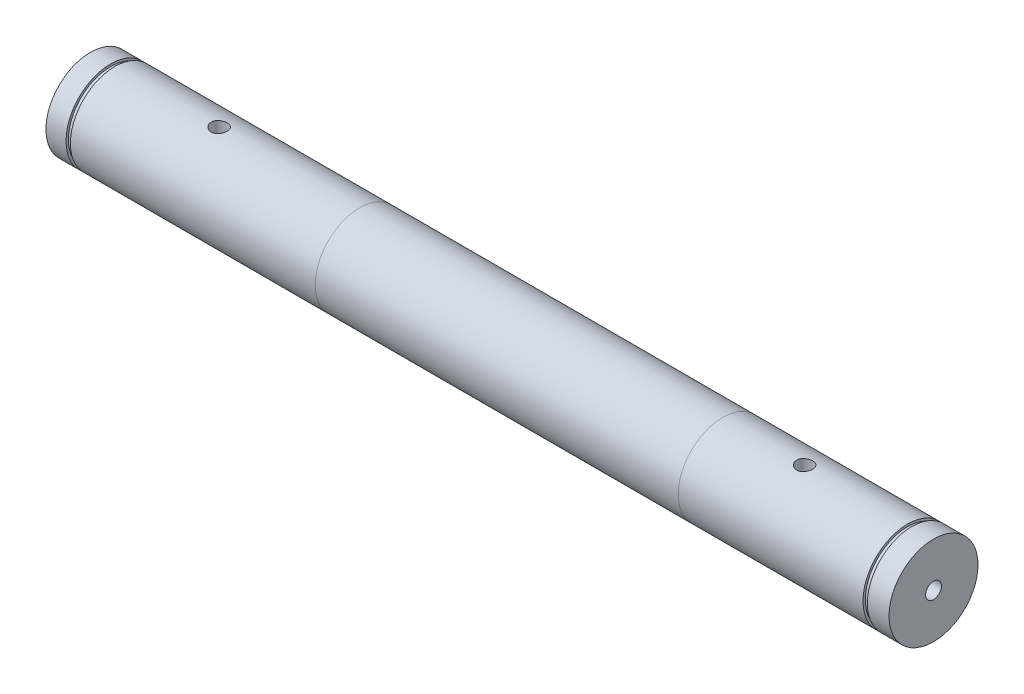
ISO-10303-21;
HEADER;
FILE_DESCRIPTION(('STEP AP214'),'2;1');
FILE_NAME('part.step','',(''),(''),'','','');
FILE_SCHEMA(('AUTOMOTIVE_DESIGN { 1 0 10303 214 1 1 1 1 }'));
ENDSEC;
DATA;
#1=APPLICATION_CONTEXT('core data for automotive mechanical design processes');
#2=APPLICATION_PROTOCOL_DEFINITION('international standard','automotive_design',2000,#1);
#3=PRODUCT_CONTEXT('',#1,'mechanical');
#4=PRODUCT('Part','Part','',(#3));
#5=PRODUCT_RELATED_PRODUCT_CATEGORY('part','',(#4));
#6=PRODUCT_DEFINITION_FORMATION('','',#4);
#7=PRODUCT_DEFINITION_CONTEXT('part definition',#1,'design');
#8=PRODUCT_DEFINITION('design','',#6,#7);
#9=PRODUCT_DEFINITION_SHAPE('','',#8);
#10=(LENGTH_UNIT() NAMED_UNIT(*) SI_UNIT(.MILLI.,.METRE.));
#11=(NAMED_UNIT(*) PLANE_ANGLE_UNIT() SI_UNIT($,.RADIAN.));
#12=(NAMED_UNIT(*) SI_UNIT($,.STERADIAN.) SOLID_ANGLE_UNIT());
#13=UNCERTAINTY_MEASURE_WITH_UNIT(LENGTH_MEASURE(1.E-05),#10,'distance_accuracy_value','');
#14=(GEOMETRIC_REPRESENTATION_CONTEXT(3) GLOBAL_UNCERTAINTY_ASSIGNED_CONTEXT((#13)) GLOBAL_UNIT_ASSIGNED_CONTEXT((#10,
#11,#12)) REPRESENTATION_CONTEXT('',''));
#15=CARTESIAN_POINT('',(0.,0.,0.));
#16=DIRECTION('',(0.,0.,1.));
#17=DIRECTION('',(1.,0.,0.));
#18=AXIS2_PLACEMENT_3D('',#15,#16,#17);
#19=CARTESIAN_POINT('',(-65.,19.,0.));
#20=DIRECTION('',(-1.,0.,0.));
#21=DIRECTION('',(0.,0.,1.));
#22=AXIS2_PLACEMENT_3D('',#19,#20,#21);
#23=PLANE('',#22);
#24=CARTESIAN_POINT('',(-65.,0.,0.));
#25=DIRECTION('',(1.,0.,0.));
#26=DIRECTION('',(0.,0.,-1.));
#27=AXIS2_PLACEMENT_3D('',#24,#25,#26);
#28=CIRCLE('',#27,19.);
#29=CARTESIAN_POINT('',(-65.,0.,-19.));
#30=VERTEX_POINT('',#29);
#31=EDGE_CURVE('E143',#30,#30,#28,.T.);
#32=ORIENTED_EDGE('',*,*,#31,.T.);
#33=EDGE_LOOP('',(#32));
#34=FACE_BOUND('',#33,.T.);
#35=CARTESIAN_POINT('',(-65.,0.,0.));
#36=DIRECTION('',(-1.,0.,0.));
#37=DIRECTION('',(0.,0.,1.));
#38=AXIS2_PLACEMENT_3D('',#35,#36,#37);
#39=CIRCLE('',#38,19.0001);
#40=CARTESIAN_POINT('',(-65.,0.,19.0001));
#41=VERTEX_POINT('',#40);
#42=EDGE_CURVE('E60',#41,#41,#39,.T.);
#43=ORIENTED_EDGE('',*,*,#42,.T.);
#44=EDGE_LOOP('',(#43));
#45=FACE_BOUND('',#44,.T.);
#46=ADVANCED_FACE('F55',(#34,#45),#23,.T.);
#47=CARTESIAN_POINT('',(180.,0.,0.));
#48=DIRECTION('',(1.,0.,0.));
#49=DIRECTION('',(0.,0.,-1.));
#50=AXIS2_PLACEMENT_3D('',#47,#48,#49);
#51=CYLINDRICAL_SURFACE('',#50,19.);
#52=ORIENTED_EDGE('',*,*,#31,.F.);
#53=EDGE_LOOP('',(#52));
#54=FACE_BOUND('',#53,.T.);
#55=CARTESIAN_POINT('',(-125.,18.6933143128767,-3.39999999999999));
#56=CARTESIAN_POINT('',(-125.189331753353,18.6933178867436,-3.39999258265061));
#57=CARTESIAN_POINT('',(-125.378761631134,18.6962219395753,-3.38413174651706));
#58=CARTESIAN_POINT('',(-125.752291137871,18.7075115667315,-3.32114376759655));
#59=CARTESIAN_POINT('',(-125.936385929427,18.7159019626303,-3.27398912226165));
#60=CARTESIAN_POINT('',(-126.293786092897,18.737184255374,-3.14989854750344));
#61=CARTESIAN_POINT('',(-126.467100916784,18.7500721413048,-3.07298914710066));
#62=CARTESIAN_POINT('',(-126.798353030278,18.7788925325816,-2.89164080941314));
#63=CARTESIAN_POINT('',(-126.956291741895,18.7948247559776,-2.78720442118902));
#64=CARTESIAN_POINT('',(-127.254114979187,18.8281405946573,-2.55250332976381));
#65=CARTESIAN_POINT('',(-127.393799725705,18.845537313872,-2.4219869408782));
#66=CARTESIAN_POINT('',(-127.649411545907,18.8797059582988,-2.13937470562974));
#67=CARTESIAN_POINT('',(-127.765337125611,18.896477844167,-1.9872775032804));
#68=CARTESIAN_POINT('',(-127.97089893371,18.9276467742116,-1.66451623870905));
#69=CARTESIAN_POINT('',(-128.06034780756,18.9420265924623,-1.49373104745276));
#70=CARTESIAN_POINT('',(-128.209211220713,18.9666448485398,-1.13925767111149));
#71=CARTESIAN_POINT('',(-128.268628009267,18.9768835965002,-0.955570453496858));
#72=CARTESIAN_POINT('',(-128.355125652901,18.9919735457278,-0.58257505175427));
#73=CARTESIAN_POINT('',(-128.382542856144,18.9968807483784,-0.393347169611865));
#74=CARTESIAN_POINT('',(-128.405310171102,19.0009474622043,-0.0129178687317526));
#75=CARTESIAN_POINT('',(-128.400662779929,19.000107420961,0.178283395165884));
#76=CARTESIAN_POINT('',(-128.359692629151,18.9928183005088,0.554928265715592));
#77=CARTESIAN_POINT('',(-128.323731951324,18.9864333405515,0.740412677774006));
#78=CARTESIAN_POINT('',(-128.221727614246,18.9688435116848,1.10267144287136));
#79=CARTESIAN_POINT('',(-128.155682932631,18.9576384789723,1.27944549967414));
#80=CARTESIAN_POINT('',(-127.995034089232,18.9315594541004,1.6203270947338));
#81=CARTESIAN_POINT('',(-127.900283301535,18.9166666987673,1.78436403787881));
#82=CARTESIAN_POINT('',(-127.685019640589,18.8848624894979,2.09434593400835));
#83=CARTESIAN_POINT('',(-127.564504373202,18.8679508480233,2.2402892036639));
#84=CARTESIAN_POINT('',(-127.299131884899,18.8337063495992,2.51208380323722));
#85=CARTESIAN_POINT('',(-127.153958005001,18.8163709090591,2.63762582602129));
#86=CARTESIAN_POINT('',(-126.844449190012,18.7834596772822,2.86262325041768));
#87=CARTESIAN_POINT('',(-126.680114021704,18.7678839074673,2.9620783344717));
#88=CARTESIAN_POINT('',(-126.336559282488,18.7402527815937,3.13215518889858));
#89=CARTESIAN_POINT('',(-126.157318647899,18.7282025200313,3.20273529185498));
#90=CARTESIAN_POINT('',(-125.789260165896,18.7090672675827,3.31269492597933));
#91=CARTESIAN_POINT('',(-125.600443302082,18.7019817678564,3.35207765462952));
#92=CARTESIAN_POINT('',(-125.22137213968,18.6936780552635,3.39807984719533));
#93=CARTESIAN_POINT('',(-125.031173274732,18.6923805318584,3.40514222028133));
#94=CARTESIAN_POINT('',(-124.65231294125,18.6955878681093,3.38748753738839));
#95=CARTESIAN_POINT('',(-124.463651404188,18.7000924676832,3.36277190586979));
#96=CARTESIAN_POINT('',(-124.094656293815,18.7143228727437,3.28264194108129));
#97=CARTESIAN_POINT('',(-123.914271282921,18.7240096591025,3.22745692783713));
#98=CARTESIAN_POINT('',(-123.565308562214,18.7474797401333,3.08819681851347));
#99=CARTESIAN_POINT('',(-123.396731655124,18.761263312974,3.00411976062502));
#100=CARTESIAN_POINT('',(-123.074210710119,18.7915560773113,2.80843184356518));
#101=CARTESIAN_POINT('',(-122.920440082176,18.8080925260938,2.6965394782446));
#102=CARTESIAN_POINT('',(-122.63369764004,18.8419498563851,2.44877961855283));
#103=CARTESIAN_POINT('',(-122.500727523839,18.8592708017853,2.31291016880456));
#104=CARTESIAN_POINT('',(-122.257721812595,18.8929986712471,2.01908149412177));
#105=CARTESIAN_POINT('',(-122.14798304087,18.9093920074667,1.8608749852286));
#106=CARTESIAN_POINT('',(-121.956643231765,18.9391935856405,1.52801400897426));
#107=CARTESIAN_POINT('',(-121.875041181254,18.9526019350702,1.35336013412842));
#108=CARTESIAN_POINT('',(-121.742743024189,18.974864083545,0.993408382903684));
#109=CARTESIAN_POINT('',(-121.691897112933,18.9837399256773,0.80816698891058));
#110=CARTESIAN_POINT('',(-121.622074541551,18.9960306771483,0.431601120228471));
#111=CARTESIAN_POINT('',(-121.60309483975,18.9994461076893,0.24027722789875));
#112=CARTESIAN_POINT('',(-121.597641578918,19.0004221171917,-0.140168453580779));
#113=CARTESIAN_POINT('',(-121.61071833194,18.9980636924074,-0.329283737732548));
#114=CARTESIAN_POINT('',(-121.668027081332,18.9879240296579,-0.702577096108203));
#115=CARTESIAN_POINT('',(-121.71225883447,18.9801428340291,-0.886755208865794));
#116=CARTESIAN_POINT('',(-121.830439541884,18.960030388816,-1.24473624175299));
#117=CARTESIAN_POINT('',(-121.904344684562,18.9477058494871,-1.41855402587999));
#118=CARTESIAN_POINT('',(-122.079722093384,18.919845596935,-1.75139036929755));
#119=CARTESIAN_POINT('',(-122.181195982162,18.9043096947112,-1.91040805674856));
#120=CARTESIAN_POINT('',(-122.410398095146,18.8714874952036,-2.21138177891458));
#121=CARTESIAN_POINT('',(-122.538453138157,18.8541809167289,-2.35308674616892));
#122=CARTESIAN_POINT('',(-122.816500678689,18.8199010769299,-2.61315388002542));
#123=CARTESIAN_POINT('',(-122.966498314786,18.8029278947401,-2.73151056357506));
#124=CARTESIAN_POINT('',(-123.285659873639,18.7710832961496,-2.94243730213483));
#125=CARTESIAN_POINT('',(-123.454972655114,18.7562305096798,-3.03478498834288));
#126=CARTESIAN_POINT('',(-123.806913969608,18.7305306819774,-3.1895812646598));
#127=CARTESIAN_POINT('',(-123.989529422265,18.7196797677546,-3.25205878040843));
#128=CARTESIAN_POINT('',(-124.310633085697,18.7055363459271,-3.33227148508436));
#129=CARTESIAN_POINT('',(-124.447212696318,18.7009795554671,-3.35762734765967));
#130=CARTESIAN_POINT('',(-124.722510666195,18.6948672638607,-3.39149412889492));
#131=CARTESIAN_POINT('',(-124.861228975986,18.6933116934049,-3.40000543655858));
#132=CARTESIAN_POINT('',(-125.,18.6933143128767,-3.39999999999999));
#133=B_SPLINE_CURVE_WITH_KNOTS('',3,(#55,#56,#57,#58,#59,#60,#61,#62,#63,#64,#65,#66,#67,#68,
#69,#70,#71,#72,#73,#74,#75,#76,#77,#78,#79,#80,#81,#82,#83,#84,#85,#86,#87,#88,#89,#90,#91,#92,
#93,#94,#95,#96,#97,#98,#99,#100,#101,#102,#103,#104,#105,#106,#107,#108,#109,#110,#111,#112,
#113,#114,#115,#116,#117,#118,#119,#120,#121,#122,#123,#124,#125,#126,#127,#128,#129,#130,#131,
#132),.UNSPECIFIED.,.T.,.F.,(4,2,2,2,2,2,2,2,2,2,2,2,2,2,2,2,2,2,2,2,2,2,2,2,2,2,2,2,2,2,2,2,2,
2,2,2,2,2,4),(0.,0.567487588911738,1.13547457563479,1.70295631398716,2.27038552071299,
2.84358101727069,3.41681254536255,3.99400838954016,4.57116099826724,5.14219089853318,
5.71317632889529,6.27764572338032,6.84213430204221,7.40955624599865,7.97703094000496,
8.55243654982518,9.12784916377711,9.70408921027479,10.280270189116,10.848531224311,
11.4167667878913,11.9807828443213,12.5448372057751,13.1148507173496,13.6849107361163,
14.2618651559548,14.8387987989919,15.412899242,15.9869448832218,16.5529840104056,
17.119018718472,17.6842207537257,18.2494560626825,18.8221031636715,19.3948845840018,
19.9724239329968,20.5494028665966,20.9653534461914,21.3812944198207),.UNSPECIFIED.);
#134=CARTESIAN_POINT('',(-125.,18.6933143128767,-3.39999999999999));
#135=VERTEX_POINT('',#134);
#136=EDGE_CURVE('E164',#135,#135,#133,.T.);
#137=ORIENTED_EDGE('',*,*,#136,.F.);
#138=EDGE_LOOP('',(#137));
#139=FACE_BOUND('',#138,.T.);
#140=CARTESIAN_POINT('',(-125.,-18.6933143128767,3.39999999999999));
#141=CARTESIAN_POINT('',(-125.189331753353,-18.6933178867436,3.39999258265061));
#142=CARTESIAN_POINT('',(-125.378761631134,-18.6962219395754,3.38413174651706));
#143=CARTESIAN_POINT('',(-125.752291137871,-18.7075115667316,3.32114376759655));
#144=CARTESIAN_POINT('',(-125.936385929427,-18.7159019626304,3.27398912226165));
#145=CARTESIAN_POINT('',(-126.293786092897,-18.7371842553741,3.14989854750344));
#146=CARTESIAN_POINT('',(-126.467100916784,-18.7500721413049,3.07298914710066));
#147=CARTESIAN_POINT('',(-126.798353030278,-18.7788925325817,2.89164080941314));
#148=CARTESIAN_POINT('',(-126.956291741895,-18.7948247559777,2.78720442118902));
#149=CARTESIAN_POINT('',(-127.254114979187,-18.8281405946574,2.55250332976381));
#150=CARTESIAN_POINT('',(-127.393799725705,-18.8455373138721,2.4219869408782));
#151=CARTESIAN_POINT('',(-127.649411545907,-18.8797059582988,2.13937470562974));
#152=CARTESIAN_POINT('',(-127.765337125611,-18.8964778441671,1.9872775032804));
#153=CARTESIAN_POINT('',(-127.97089893371,-18.9276467742117,1.66451623870905));
#154=CARTESIAN_POINT('',(-128.06034780756,-18.9420265924624,1.49373104745276));
#155=CARTESIAN_POINT('',(-128.209211220713,-18.9666448485398,1.13925767111149));
#156=CARTESIAN_POINT('',(-128.268628009267,-18.9768835965003,0.955570453496858));
#157=CARTESIAN_POINT('',(-128.355125652901,-18.9919735457279,0.58257505175427));
#158=CARTESIAN_POINT('',(-128.382542856144,-18.9968807483785,0.393347169611865));
#159=CARTESIAN_POINT('',(-128.405310171102,-19.0009474622044,0.0129178687317526));
#160=CARTESIAN_POINT('',(-128.400662779929,-19.0001074209611,-0.178283395165884));
#161=CARTESIAN_POINT('',(-128.359692629151,-18.9928183005089,-0.554928265715592));
#162=CARTESIAN_POINT('',(-128.323731951324,-18.9864333405516,-0.740412677774006));
#163=CARTESIAN_POINT('',(-128.221727614246,-18.9688435116849,-1.10267144287136));
#164=CARTESIAN_POINT('',(-128.155682932631,-18.9576384789723,-1.27944549967414));
#165=CARTESIAN_POINT('',(-127.995034089232,-18.9315594541005,-1.6203270947338));
#166=CARTESIAN_POINT('',(-127.900283301535,-18.9166666987674,-1.78436403787881));
#167=CARTESIAN_POINT('',(-127.685019640589,-18.884862489498,-2.09434593400835));
#168=CARTESIAN_POINT('',(-127.564504373202,-18.8679508480234,-2.2402892036639));
#169=CARTESIAN_POINT('',(-127.299131884899,-18.8337063495993,-2.51208380323722));
#170=CARTESIAN_POINT('',(-127.153958005001,-18.8163709090592,-2.63762582602129));
#171=CARTESIAN_POINT('',(-126.844449190012,-18.7834596772822,-2.86262325041768));
#172=CARTESIAN_POINT('',(-126.680114021704,-18.7678839074673,-2.9620783344717));
#173=CARTESIAN_POINT('',(-126.336559282488,-18.7402527815937,-3.13215518889858));
#174=CARTESIAN_POINT('',(-126.157318647899,-18.7282025200314,-3.20273529185498));
#175=CARTESIAN_POINT('',(-125.789260165896,-18.7090672675828,-3.31269492597933));
#176=CARTESIAN_POINT('',(-125.600443302082,-18.7019817678565,-3.35207765462952));
#177=CARTESIAN_POINT('',(-125.22137213968,-18.6936780552636,-3.39807984719533));
#178=CARTESIAN_POINT('',(-125.031173274732,-18.6923805318585,-3.40514222028133));
#179=CARTESIAN_POINT('',(-124.65231294125,-18.6955878681094,-3.38748753738839));
#180=CARTESIAN_POINT('',(-124.463651404188,-18.7000924676833,-3.36277190586979));
#181=CARTESIAN_POINT('',(-124.094656293815,-18.7143228727438,-3.28264194108129));
#182=CARTESIAN_POINT('',(-123.914271282921,-18.7240096591026,-3.22745692783713));
#183=CARTESIAN_POINT('',(-123.565308562214,-18.7474797401334,-3.08819681851347));
#184=CARTESIAN_POINT('',(-123.396731655124,-18.7612633129741,-3.00411976062502));
#185=CARTESIAN_POINT('',(-123.074210710119,-18.7915560773114,-2.80843184356518));
#186=CARTESIAN_POINT('',(-122.920440082176,-18.8080925260939,-2.6965394782446));
#187=CARTESIAN_POINT('',(-122.63369764004,-18.8419498563852,-2.44877961855283));
#188=CARTESIAN_POINT('',(-122.500727523839,-18.8592708017854,-2.31291016880456));
#189=CARTESIAN_POINT('',(-122.257721812595,-18.8929986712472,-2.01908149412177));
#190=CARTESIAN_POINT('',(-122.14798304087,-18.9093920074668,-1.8608749852286));
#191=CARTESIAN_POINT('',(-121.956643231765,-18.9391935856406,-1.52801400897426));
#192=CARTESIAN_POINT('',(-121.875041181254,-18.9526019350703,-1.35336013412842));
#193=CARTESIAN_POINT('',(-121.742743024189,-18.9748640835451,-0.993408382903684));
#194=CARTESIAN_POINT('',(-121.691897112933,-18.9837399256774,-0.80816698891058));
#195=CARTESIAN_POINT('',(-121.622074541551,-18.9960306771484,-0.431601120228471));
#196=CARTESIAN_POINT('',(-121.60309483975,-18.9994461076894,-0.24027722789875));
#197=CARTESIAN_POINT('',(-121.597641578918,-19.0004221171918,0.140168453580779));
#198=CARTESIAN_POINT('',(-121.61071833194,-18.9980636924075,0.329283737732548));
#199=CARTESIAN_POINT('',(-121.668027081332,-18.987924029658,0.702577096108203));
#200=CARTESIAN_POINT('',(-121.71225883447,-18.9801428340292,0.886755208865794));
#201=CARTESIAN_POINT('',(-121.830439541884,-18.9600303888161,1.24473624175299));
#202=CARTESIAN_POINT('',(-121.904344684562,-18.9477058494872,1.41855402587999));
#203=CARTESIAN_POINT('',(-122.079722093384,-18.919845596935,1.75139036929755));
#204=CARTESIAN_POINT('',(-122.181195982162,-18.9043096947113,1.91040805674856));
#205=CARTESIAN_POINT('',(-122.410398095146,-18.8714874952037,2.21138177891458));
#206=CARTESIAN_POINT('',(-122.538453138157,-18.854180916729,2.35308674616892));
#207=CARTESIAN_POINT('',(-122.816500678689,-18.81990107693,2.61315388002542));
#208=CARTESIAN_POINT('',(-122.966498314786,-18.8029278947401,2.73151056357506));
#209=CARTESIAN_POINT('',(-123.285659873639,-18.7710832961497,2.94243730213483));
#210=CARTESIAN_POINT('',(-123.454972655114,-18.7562305096798,3.03478498834288));
#211=CARTESIAN_POINT('',(-123.806913969608,-18.7305306819775,3.1895812646598));
#212=CARTESIAN_POINT('',(-123.989529422265,-18.7196797677546,3.25205878040843));
#213=CARTESIAN_POINT('',(-124.310633085697,-18.7055363459271,3.33227148508436));
#214=CARTESIAN_POINT('',(-124.447212696318,-18.7009795554672,3.35762734765967));
#215=CARTESIAN_POINT('',(-124.722510666195,-18.6948672638608,3.39149412889492));
#216=CARTESIAN_POINT('',(-124.861228975986,-18.693311693405,3.40000543655858));
#217=CARTESIAN_POINT('',(-125.,-18.6933143128767,3.39999999999999));
#218=B_SPLINE_CURVE_WITH_KNOTS('',3,(#140,#141,#142,#143,#144,#145,#146,#147,#148,#149,#150,
#151,#152,#153,#154,#155,#156,#157,#158,#159,#160,#161,#162,#163,#164,#165,#166,#167,#168,#169,
#170,#171,#172,#173,#174,#175,#176,#177,#178,#179,#180,#181,#182,#183,#184,#185,#186,#187,#188,
#189,#190,#191,#192,#193,#194,#195,#196,#197,#198,#199,#200,#201,#202,#203,#204,#205,#206,#207,
#208,#209,#210,#211,#212,#213,#214,#215,#216,#217),.UNSPECIFIED.,.T.,.F.,(4,2,2,2,2,2,2,2,2,2,2,
2,2,2,2,2,2,2,2,2,2,2,2,2,2,2,2,2,2,2,2,2,2,2,2,2,2,2,4),(0.,0.567487588911738,1.13547457563479,
1.70295631398716,2.27038552071299,2.84358101727069,3.41681254536255,3.99400838954016,
4.57116099826724,5.14219089853318,5.71317632889529,6.27764572338032,6.84213430204221,
7.40955624599865,7.97703094000496,8.55243654982518,9.12784916377711,9.70408921027479,
10.280270189116,10.848531224311,11.4167667878913,11.9807828443213,12.5448372057751,
13.1148507173496,13.6849107361163,14.2618651559548,14.8387987989919,15.412899242,
15.9869448832218,16.5529840104056,17.119018718472,17.6842207537257,18.2494560626825,
18.8221031636715,19.3948845840018,19.9724239329968,20.5494028665966,20.9653534461914,
21.3812944198207),.UNSPECIFIED.);
#219=CARTESIAN_POINT('',(-125.,-18.6933143128767,3.39999999999999));
#220=VERTEX_POINT('',#219);
#221=EDGE_CURVE('E240',#220,#220,#218,.T.);
#222=ORIENTED_EDGE('',*,*,#221,.F.);
#223=EDGE_LOOP('',(#222));
#224=FACE_BOUND('',#223,.T.);
#225=CARTESIAN_POINT('',(-169.55,0.,0.));
#226=DIRECTION('',(-1.,0.,0.));
#227=DIRECTION('',(0.,0.,1.));
#228=AXIS2_PLACEMENT_3D('',#225,#226,#227);
#229=CIRCLE('',#228,19.);
#230=CARTESIAN_POINT('',(-169.55,0.,19.));
#231=VERTEX_POINT('',#230);
#232=EDGE_CURVE('E276',#231,#231,#229,.T.);
#233=ORIENTED_EDGE('',*,*,#232,.F.);
#234=EDGE_LOOP('',(#233));
#235=FACE_BOUND('',#234,.T.);
#236=ADVANCED_FACE('F188',(#54,#139,#224,#235),#51,.T.);
#237=CARTESIAN_POINT('',(180.,0.,0.));
#238=DIRECTION('',(1.,0.,0.));
#239=DIRECTION('',(0.,0.,-1.));
#240=AXIS2_PLACEMENT_3D('',#237,#238,#239);
#241=CYLINDRICAL_SURFACE('',#240,19.);
#242=CARTESIAN_POINT('',(90.,0.,0.));
#243=DIRECTION('',(1.,0.,0.));
#244=DIRECTION('',(0.,0.,-1.));
#245=AXIS2_PLACEMENT_3D('',#242,#243,#244);
#246=CIRCLE('',#245,19.);
#247=CARTESIAN_POINT('',(90.,0.,-19.));
#248=VERTEX_POINT('',#247);
#249=EDGE_CURVE('E135',#248,#248,#246,.T.);
#250=ORIENTED_EDGE('',*,*,#249,.T.);
#251=EDGE_LOOP('',(#250));
#252=FACE_BOUND('',#251,.T.);
#253=CARTESIAN_POINT('',(125.,18.6933143128767,-3.39999999999999));
#254=CARTESIAN_POINT('',(124.810668246647,18.6933178867436,-3.3999925826506));
#255=CARTESIAN_POINT('',(124.621238368866,18.6962219395753,-3.38413174651705));
#256=CARTESIAN_POINT('',(124.247708862129,18.7075115667315,-3.32114376759655));
#257=CARTESIAN_POINT('',(124.063614070573,18.7159019626303,-3.27398912226164));
#258=CARTESIAN_POINT('',(123.706213907103,18.737184255374,-3.14989854750343));
#259=CARTESIAN_POINT('',(123.532899083216,18.7500721413048,-3.07298914710066));
#260=CARTESIAN_POINT('',(123.201646969722,18.7788925325816,-2.89164080941314));
#261=CARTESIAN_POINT('',(123.043708258105,18.7948247559776,-2.78720442118901));
#262=CARTESIAN_POINT('',(122.745885020813,18.8281405946573,-2.5525033297638));
#263=CARTESIAN_POINT('',(122.606200274295,18.845537313872,-2.4219869408782));
#264=CARTESIAN_POINT('',(122.350588454093,18.8797059582988,-2.13937470562974));
#265=CARTESIAN_POINT('',(122.234662874389,18.896477844167,-1.9872775032804));
#266=CARTESIAN_POINT('',(122.02910106629,18.9276467742116,-1.66451623870904));
#267=CARTESIAN_POINT('',(121.93965219244,18.9420265924623,-1.49373104745275));
#268=CARTESIAN_POINT('',(121.790788779287,18.9666448485398,-1.13925767111149));
#269=CARTESIAN_POINT('',(121.731371990733,18.9768835965002,-0.955570453496858));
#270=CARTESIAN_POINT('',(121.644874347099,18.9919735457278,-0.582575051754269));
#271=CARTESIAN_POINT('',(121.617457143856,18.9968807483784,-0.393347169611864));
#272=CARTESIAN_POINT('',(121.594689828898,19.0009474622043,-0.0129178687317464));
#273=CARTESIAN_POINT('',(121.599337220071,19.000107420961,0.178283395165894));
#274=CARTESIAN_POINT('',(121.640307370849,18.9928183005088,0.554928265715601));
#275=CARTESIAN_POINT('',(121.676268048676,18.9864333405515,0.740412677774012));
#276=CARTESIAN_POINT('',(121.778272385754,18.9688435116848,1.10267144287136));
#277=CARTESIAN_POINT('',(121.844317067369,18.9576384789723,1.27944549967414));
#278=CARTESIAN_POINT('',(122.004965910768,18.9315594541005,1.6203270947338));
#279=CARTESIAN_POINT('',(122.099716698465,18.9166666987673,1.78436403787881));
#280=CARTESIAN_POINT('',(122.314980359411,18.8848624894979,2.09434593400835));
#281=CARTESIAN_POINT('',(122.435495626798,18.8679508480233,2.2402892036639));
#282=CARTESIAN_POINT('',(122.700868115101,18.8337063495992,2.51208380323723));
#283=CARTESIAN_POINT('',(122.846041994999,18.8163709090591,2.6376258260213));
#284=CARTESIAN_POINT('',(123.155550809988,18.7834596772822,2.86262325041768));
#285=CARTESIAN_POINT('',(123.319885978296,18.7678839074673,2.96207833447169));
#286=CARTESIAN_POINT('',(123.663440717512,18.7402527815937,3.13215518889857));
#287=CARTESIAN_POINT('',(123.842681352101,18.7282025200313,3.20273529185497));
#288=CARTESIAN_POINT('',(124.210739834104,18.7090672675827,3.31269492597933));
#289=CARTESIAN_POINT('',(124.399556697918,18.7019817678564,3.35207765462952));
#290=CARTESIAN_POINT('',(124.77862786032,18.6936780552635,3.39807984719532));
#291=CARTESIAN_POINT('',(124.968826725268,18.6923805318584,3.40514222028133));
#292=CARTESIAN_POINT('',(125.34768705875,18.6955878681093,3.38748753738839));
#293=CARTESIAN_POINT('',(125.536348595812,18.7000924676832,3.36277190586978));
#294=CARTESIAN_POINT('',(125.905343706185,18.7143228727437,3.28264194108128));
#295=CARTESIAN_POINT('',(126.085728717079,18.7240096591025,3.22745692783712));
#296=CARTESIAN_POINT('',(126.434691437786,18.7474797401333,3.08819681851346));
#297=CARTESIAN_POINT('',(126.603268344876,18.761263312974,3.004119760625));
#298=CARTESIAN_POINT('',(126.925789289881,18.7915560773113,2.80843184356515));
#299=CARTESIAN_POINT('',(127.079559917824,18.8080925260938,2.69653947824456));
#300=CARTESIAN_POINT('',(127.36630235996,18.8419498563851,2.4487796185528));
#301=CARTESIAN_POINT('',(127.499272476161,18.8592708017853,2.31291016880454));
#302=CARTESIAN_POINT('',(127.742278187405,18.8929986712471,2.01908149412175));
#303=CARTESIAN_POINT('',(127.85201695913,18.9093920074667,1.86087498522859));
#304=CARTESIAN_POINT('',(128.043356768235,18.9391935856405,1.52801400897425));
#305=CARTESIAN_POINT('',(128.124958818746,18.9526019350702,1.3533601341284));
#306=CARTESIAN_POINT('',(128.257256975811,18.974864083545,0.993408382903667));
#307=CARTESIAN_POINT('',(128.308102887067,18.9837399256773,0.808166988910567));
#308=CARTESIAN_POINT('',(128.377925458449,18.9960306771483,0.43160112022846));
#309=CARTESIAN_POINT('',(128.39690516025,18.9994461076893,0.240277227898739));
#310=CARTESIAN_POINT('',(128.402358421081,19.0004221171918,-0.140168453580789));
#311=CARTESIAN_POINT('',(128.38928166806,18.9980636924074,-0.329283737732558));
#312=CARTESIAN_POINT('',(128.331972918668,18.9879240296579,-0.702577096108211));
#313=CARTESIAN_POINT('',(128.28774116553,18.9801428340291,-0.886755208865801));
#314=CARTESIAN_POINT('',(128.169560458116,18.960030388816,-1.244736241753));
#315=CARTESIAN_POINT('',(128.095655315438,18.9477058494871,-1.41855402587999));
#316=CARTESIAN_POINT('',(127.920277906616,18.919845596935,-1.75139036929755));
#317=CARTESIAN_POINT('',(127.818804017838,18.9043096947112,-1.91040805674855));
#318=CARTESIAN_POINT('',(127.589601904854,18.8714874952036,-2.21138177891458));
#319=CARTESIAN_POINT('',(127.461546861843,18.854180916729,-2.35308674616892));
#320=CARTESIAN_POINT('',(127.183499321311,18.8199010769299,-2.61315388002543));
#321=CARTESIAN_POINT('',(127.033501685214,18.8029278947401,-2.73151056357506));
#322=CARTESIAN_POINT('',(126.714340126361,18.7710832961496,-2.94243730213483));
#323=CARTESIAN_POINT('',(126.545027344886,18.7562305096798,-3.03478498834289));
#324=CARTESIAN_POINT('',(126.193086030392,18.7305306819774,-3.18958126465979));
#325=CARTESIAN_POINT('',(126.010470577735,18.7196797677546,-3.25205878040842));
#326=CARTESIAN_POINT('',(125.689366914303,18.7055363459271,-3.33227148508435));
#327=CARTESIAN_POINT('',(125.552787303682,18.7009795554671,-3.35762734765967));
#328=CARTESIAN_POINT('',(125.277489333805,18.6948672638607,-3.39149412889491));
#329=CARTESIAN_POINT('',(125.138771024014,18.693311693405,-3.40000543655857));
#330=CARTESIAN_POINT('',(125.,18.6933143128767,-3.39999999999999));
#331=B_SPLINE_CURVE_WITH_KNOTS('',3,(#253,#254,#255,#256,#257,#258,#259,#260,#261,#262,#263,
#264,#265,#266,#267,#268,#269,#270,#271,#272,#273,#274,#275,#276,#277,#278,#279,#280,#281,#282,
#283,#284,#285,#286,#287,#288,#289,#290,#291,#292,#293,#294,#295,#296,#297,#298,#299,#300,#301,
#302,#303,#304,#305,#306,#307,#308,#309,#310,#311,#312,#313,#314,#315,#316,#317,#318,#319,#320,
#321,#322,#323,#324,#325,#326,#327,#328,#329,#330),.UNSPECIFIED.,.T.,.F.,(4,2,2,2,2,2,2,2,2,2,2,
2,2,2,2,2,2,2,2,2,2,2,2,2,2,2,2,2,2,2,2,2,2,2,2,2,2,2,4),(0.,0.567487588911752,1.13547457563479,
1.70295631398714,2.27038552071298,2.84358101727067,3.41681254536255,3.99400838954015,
4.57116099826723,5.14219089853317,5.71317632889529,6.27764572338032,6.8421343020422,
7.40955624599864,7.97703094000496,8.55243654982518,9.12784916377709,9.70408921027476,
10.280270189116,10.848531224311,11.4167667878913,11.9807828443213,12.5448372057751,
13.1148507173496,13.6849107361162,14.2618651559548,14.8387987989919,15.412899242,
15.9869448832218,16.5529840104056,17.119018718472,17.6842207537257,18.2494560626825,
18.8221031636714,19.3948845840018,19.9724239329968,20.5494028665966,20.9653534461914,
21.3812944198206),.UNSPECIFIED.);
#332=CARTESIAN_POINT('',(125.,18.6933143128767,-3.39999999999999));
#333=VERTEX_POINT('',#332);
#334=EDGE_CURVE('E155',#333,#333,#331,.T.);
#335=ORIENTED_EDGE('',*,*,#334,.F.);
#336=EDGE_LOOP('',(#335));
#337=FACE_BOUND('',#336,.T.);
#338=CARTESIAN_POINT('',(125.,-18.6933143128767,3.39999999999999));
#339=CARTESIAN_POINT('',(124.810668246647,-18.6933178867436,3.3999925826506));
#340=CARTESIAN_POINT('',(124.621238368866,-18.6962219395754,3.38413174651705));
#341=CARTESIAN_POINT('',(124.247708862129,-18.7075115667316,3.32114376759655));
#342=CARTESIAN_POINT('',(124.063614070573,-18.7159019626304,3.27398912226164));
#343=CARTESIAN_POINT('',(123.706213907103,-18.7371842553741,3.14989854750343));
#344=CARTESIAN_POINT('',(123.532899083216,-18.7500721413049,3.07298914710066));
#345=CARTESIAN_POINT('',(123.201646969722,-18.7788925325817,2.89164080941314));
#346=CARTESIAN_POINT('',(123.043708258105,-18.7948247559777,2.78720442118901));
#347=CARTESIAN_POINT('',(122.745885020813,-18.8281405946574,2.5525033297638));
#348=CARTESIAN_POINT('',(122.606200274295,-18.8455373138721,2.4219869408782));
#349=CARTESIAN_POINT('',(122.350588454093,-18.8797059582989,2.13937470562974));
#350=CARTESIAN_POINT('',(122.234662874389,-18.8964778441671,1.9872775032804));
#351=CARTESIAN_POINT('',(122.02910106629,-18.9276467742117,1.66451623870904));
#352=CARTESIAN_POINT('',(121.93965219244,-18.9420265924624,1.49373104745275));
#353=CARTESIAN_POINT('',(121.790788779287,-18.9666448485399,1.13925767111149));
#354=CARTESIAN_POINT('',(121.731371990733,-18.9768835965003,0.955570453496858));
#355=CARTESIAN_POINT('',(121.644874347099,-18.9919735457279,0.582575051754269));
#356=CARTESIAN_POINT('',(121.617457143856,-18.9968807483785,0.393347169611864));
#357=CARTESIAN_POINT('',(121.594689828898,-19.0009474622044,0.0129178687317464));
#358=CARTESIAN_POINT('',(121.599337220071,-19.0001074209611,-0.178283395165894));
#359=CARTESIAN_POINT('',(121.640307370849,-18.9928183005089,-0.554928265715601));
#360=CARTESIAN_POINT('',(121.676268048676,-18.9864333405516,-0.740412677774012));
#361=CARTESIAN_POINT('',(121.778272385754,-18.9688435116849,-1.10267144287136));
#362=CARTESIAN_POINT('',(121.844317067369,-18.9576384789723,-1.27944549967414));
#363=CARTESIAN_POINT('',(122.004965910768,-18.9315594541005,-1.6203270947338));
#364=CARTESIAN_POINT('',(122.099716698465,-18.9166666987674,-1.78436403787881));
#365=CARTESIAN_POINT('',(122.314980359411,-18.884862489498,-2.09434593400835));
#366=CARTESIAN_POINT('',(122.435495626798,-18.8679508480234,-2.2402892036639));
#367=CARTESIAN_POINT('',(122.700868115101,-18.8337063495993,-2.51208380323723));
#368=CARTESIAN_POINT('',(122.846041994999,-18.8163709090592,-2.6376258260213));
#369=CARTESIAN_POINT('',(123.155550809988,-18.7834596772823,-2.86262325041768));
#370=CARTESIAN_POINT('',(123.319885978296,-18.7678839074674,-2.96207833447169));
#371=CARTESIAN_POINT('',(123.663440717512,-18.7402527815938,-3.13215518889857));
#372=CARTESIAN_POINT('',(123.842681352101,-18.7282025200314,-3.20273529185497));
#373=CARTESIAN_POINT('',(124.210739834104,-18.7090672675828,-3.31269492597933));
#374=CARTESIAN_POINT('',(124.399556697918,-18.7019817678565,-3.35207765462952));
#375=CARTESIAN_POINT('',(124.77862786032,-18.6936780552636,-3.39807984719532));
#376=CARTESIAN_POINT('',(124.968826725268,-18.6923805318585,-3.40514222028133));
#377=CARTESIAN_POINT('',(125.34768705875,-18.6955878681094,-3.38748753738839));
#378=CARTESIAN_POINT('',(125.536348595812,-18.7000924676833,-3.36277190586978));
#379=CARTESIAN_POINT('',(125.905343706185,-18.7143228727438,-3.28264194108128));
#380=CARTESIAN_POINT('',(126.085728717079,-18.7240096591026,-3.22745692783712));
#381=CARTESIAN_POINT('',(126.434691437786,-18.7474797401334,-3.08819681851346));
#382=CARTESIAN_POINT('',(126.603268344876,-18.7612633129741,-3.004119760625));
#383=CARTESIAN_POINT('',(126.925789289881,-18.7915560773114,-2.80843184356515));
#384=CARTESIAN_POINT('',(127.079559917824,-18.8080925260939,-2.69653947824456));
#385=CARTESIAN_POINT('',(127.36630235996,-18.8419498563852,-2.4487796185528));
#386=CARTESIAN_POINT('',(127.499272476161,-18.8592708017854,-2.31291016880454));
#387=CARTESIAN_POINT('',(127.742278187405,-18.8929986712472,-2.01908149412175));
#388=CARTESIAN_POINT('',(127.85201695913,-18.9093920074668,-1.86087498522859));
#389=CARTESIAN_POINT('',(128.043356768235,-18.9391935856406,-1.52801400897425));
#390=CARTESIAN_POINT('',(128.124958818746,-18.9526019350703,-1.3533601341284));
#391=CARTESIAN_POINT('',(128.257256975811,-18.9748640835451,-0.993408382903667));
#392=CARTESIAN_POINT('',(128.308102887067,-18.9837399256774,-0.808166988910567));
#393=CARTESIAN_POINT('',(128.377925458449,-18.9960306771484,-0.43160112022846));
#394=CARTESIAN_POINT('',(128.39690516025,-18.9994461076894,-0.240277227898739));
#395=CARTESIAN_POINT('',(128.402358421081,-19.0004221171918,0.140168453580789));
#396=CARTESIAN_POINT('',(128.38928166806,-18.9980636924075,0.329283737732558));
#397=CARTESIAN_POINT('',(128.331972918668,-18.987924029658,0.702577096108211));
#398=CARTESIAN_POINT('',(128.28774116553,-18.9801428340292,0.886755208865801));
#399=CARTESIAN_POINT('',(128.169560458116,-18.9600303888161,1.244736241753));
#400=CARTESIAN_POINT('',(128.095655315438,-18.9477058494872,1.41855402587999));
#401=CARTESIAN_POINT('',(127.920277906616,-18.9198455969351,1.75139036929755));
#402=CARTESIAN_POINT('',(127.818804017838,-18.9043096947113,1.91040805674855));
#403=CARTESIAN_POINT('',(127.589601904854,-18.8714874952037,2.21138177891458));
#404=CARTESIAN_POINT('',(127.461546861843,-18.854180916729,2.35308674616892));
#405=CARTESIAN_POINT('',(127.183499321311,-18.81990107693,2.61315388002543));
#406=CARTESIAN_POINT('',(127.033501685214,-18.8029278947401,2.73151056357506));
#407=CARTESIAN_POINT('',(126.714340126361,-18.7710832961497,2.94243730213483));
#408=CARTESIAN_POINT('',(126.545027344886,-18.7562305096799,3.03478498834289));
#409=CARTESIAN_POINT('',(126.193086030392,-18.7305306819775,3.18958126465979));
#410=CARTESIAN_POINT('',(126.010470577735,-18.7196797677547,3.25205878040842));
#411=CARTESIAN_POINT('',(125.689366914303,-18.7055363459272,3.33227148508435));
#412=CARTESIAN_POINT('',(125.552787303682,-18.7009795554672,3.35762734765967));
#413=CARTESIAN_POINT('',(125.277489333805,-18.6948672638608,3.39149412889491));
#414=CARTESIAN_POINT('',(125.138771024014,-18.693311693405,3.40000543655857));
#415=CARTESIAN_POINT('',(125.,-18.6933143128767,3.39999999999999));
#416=B_SPLINE_CURVE_WITH_KNOTS('',3,(#338,#339,#340,#341,#342,#343,#344,#345,#346,#347,#348,
#349,#350,#351,#352,#353,#354,#355,#356,#357,#358,#359,#360,#361,#362,#363,#364,#365,#366,#367,
#368,#369,#370,#371,#372,#373,#374,#375,#376,#377,#378,#379,#380,#381,#382,#383,#384,#385,#386,
#387,#388,#389,#390,#391,#392,#393,#394,#395,#396,#397,#398,#399,#400,#401,#402,#403,#404,#405,
#406,#407,#408,#409,#410,#411,#412,#413,#414,#415),.UNSPECIFIED.,.T.,.F.,(4,2,2,2,2,2,2,2,2,2,2,
2,2,2,2,2,2,2,2,2,2,2,2,2,2,2,2,2,2,2,2,2,2,2,2,2,2,2,4),(0.,0.567487588911752,1.13547457563479,
1.70295631398714,2.27038552071298,2.84358101727067,3.41681254536255,3.99400838954015,
4.57116099826723,5.14219089853317,5.71317632889529,6.27764572338032,6.8421343020422,
7.40955624599864,7.97703094000496,8.55243654982518,9.12784916377709,9.70408921027476,
10.280270189116,10.848531224311,11.4167667878913,11.9807828443213,12.5448372057751,
13.1148507173496,13.6849107361162,14.2618651559548,14.8387987989919,15.412899242,
15.9869448832218,16.5529840104056,17.119018718472,17.6842207537257,18.2494560626825,
18.8221031636714,19.3948845840018,19.9724239329968,20.5494028665966,20.9653534461914,
21.3812944198206),.UNSPECIFIED.);
#417=CARTESIAN_POINT('',(125.,-18.6933143128767,3.39999999999999));
#418=VERTEX_POINT('',#417);
#419=EDGE_CURVE('E214',#418,#418,#416,.T.);
#420=ORIENTED_EDGE('',*,*,#419,.F.);
#421=EDGE_LOOP('',(#420));
#422=FACE_BOUND('',#421,.T.);
#423=CARTESIAN_POINT('',(168.9,0.,0.));
#424=DIRECTION('',(-1.,0.,0.));
#425=DIRECTION('',(0.,0.,1.));
#426=AXIS2_PLACEMENT_3D('',#423,#424,#425);
#427=CIRCLE('',#426,18.9999999999999);
#428=CARTESIAN_POINT('',(168.9,0.,18.9999999999999));
#429=VERTEX_POINT('',#428);
#430=EDGE_CURVE('E217',#429,#429,#427,.T.);
#431=ORIENTED_EDGE('',*,*,#430,.T.);
#432=EDGE_LOOP('',(#431));
#433=FACE_BOUND('',#432,.T.);
#434=ADVANCED_FACE('F170',(#252,#337,#422,#433),#241,.T.);
#435=CARTESIAN_POINT('',(180.,0.,0.));
#436=DIRECTION('',(1.,0.,0.));
#437=DIRECTION('',(0.,0.,-1.));
#438=AXIS2_PLACEMENT_3D('',#435,#436,#437);
#439=CIRCLE('',#438,19.);
#440=CARTESIAN_POINT('',(180.,0.,-19.));
#441=VERTEX_POINT('',#440);
#442=EDGE_CURVE('E129',#441,#441,#439,.T.);
#443=ORIENTED_EDGE('',*,*,#442,.F.);
#444=EDGE_LOOP('',(#443));
#445=FACE_BOUND('',#444,.T.);
#446=CARTESIAN_POINT('',(170.75,0.,0.));
#447=DIRECTION('',(-1.,0.,0.));
#448=DIRECTION('',(0.,0.,1.));
#449=AXIS2_PLACEMENT_3D('',#446,#447,#448);
#450=CIRCLE('',#449,18.9999999999999);
#451=CARTESIAN_POINT('',(170.75,0.,18.9999999999999));
#452=VERTEX_POINT('',#451);
#453=EDGE_CURVE('E220',#452,#452,#450,.T.);
#454=ORIENTED_EDGE('',*,*,#453,.F.);
#455=EDGE_LOOP('',(#454));
#456=FACE_BOUND('',#455,.T.);
#457=ADVANCED_FACE('F208',(#445,#456),#241,.T.);
#458=CARTESIAN_POINT('',(180.,0.,0.));
#459=DIRECTION('',(1.,0.,0.));
#460=DIRECTION('',(0.,0.,-1.));
#461=AXIS2_PLACEMENT_3D('',#458,#459,#460);
#462=CYLINDRICAL_SURFACE('',#461,3.39999999999998);
#463=CARTESIAN_POINT('',(125.,0.,0.));
#464=DIRECTION('',(0.707106781186547,0.707106781186547,0.));
#465=DIRECTION('',(0.707106781186547,-0.707106781186547,0.));
#466=AXIS2_PLACEMENT_3D('',#463,#464,#465);
#467=ELLIPSE('',#466,4.8083261120685,3.39999999999998);
#468=CARTESIAN_POINT('',(125.,0.,-3.39999999999998));
#469=VERTEX_POINT('',#468);
#470=CARTESIAN_POINT('',(125.,0.,3.39999999999998));
#471=VERTEX_POINT('',#470);
#472=EDGE_CURVE('E110',#469,#471,#467,.T.);
#473=ORIENTED_EDGE('',*,*,#472,.T.);
#474=CARTESIAN_POINT('',(125.,0.,0.));
#475=DIRECTION('',(0.707106781186547,-0.707106781186547,0.));
#476=DIRECTION('',(0.707106781186547,0.707106781186547,0.));
#477=AXIS2_PLACEMENT_3D('',#474,#475,#476);
#478=ELLIPSE('',#477,4.8083261120685,3.39999999999998);
#479=EDGE_CURVE('E101',#471,#469,#478,.T.);
#480=ORIENTED_EDGE('',*,*,#479,.T.);
#481=EDGE_LOOP('',(#473,#480));
#482=FACE_BOUND('',#481,.T.);
#483=CARTESIAN_POINT('',(-125.,0.,0.));
#484=DIRECTION('',(0.707106781186547,-0.707106781186547,0.));
#485=DIRECTION('',(0.707106781186547,0.707106781186547,0.));
#486=AXIS2_PLACEMENT_3D('',#483,#484,#485);
#487=ELLIPSE('',#486,4.8083261120685,3.39999999999999);
#488=CARTESIAN_POINT('',(-125.,0.,3.39999999999999));
#489=VERTEX_POINT('',#488);
#490=CARTESIAN_POINT('',(-125.,0.,-3.39999999999999));
#491=VERTEX_POINT('',#490);
#492=EDGE_CURVE('E96',#489,#491,#487,.F.);
#493=ORIENTED_EDGE('',*,*,#492,.T.);
#494=CARTESIAN_POINT('',(-125.,0.,0.));
#495=DIRECTION('',(0.707106781186547,0.707106781186547,0.));
#496=DIRECTION('',(0.707106781186547,-0.707106781186547,0.));
#497=AXIS2_PLACEMENT_3D('',#494,#495,#496);
#498=ELLIPSE('',#497,4.8083261120685,3.39999999999999);
#499=EDGE_CURVE('E11',#491,#489,#498,.F.);
#500=ORIENTED_EDGE('',*,*,#499,.T.);
#501=EDGE_LOOP('',(#493,#500));
#502=FACE_BOUND('',#501,.T.);
#503=ADVANCED_FACE('F95',(#482,#502),#462,.F.);
#504=CARTESIAN_POINT('',(180.,0.,0.));
#505=DIRECTION('',(1.,0.,0.));
#506=DIRECTION('',(0.,0.,-1.));
#507=AXIS2_PLACEMENT_3D('',#504,#505,#506);
#508=CIRCLE('',#507,3.4);
#509=CARTESIAN_POINT('',(180.,0.,-3.4));
#510=VERTEX_POINT('',#509);
#511=EDGE_CURVE('E151',#510,#510,#508,.T.);
#512=ORIENTED_EDGE('',*,*,#511,.T.);
#513=EDGE_LOOP('',(#512));
#514=FACE_BOUND('',#513,.T.);
#515=CARTESIAN_POINT('',(125.,0.,0.));
#516=DIRECTION('',(0.707106781186547,-0.707106781186547,0.));
#517=DIRECTION('',(0.707106781186547,0.707106781186547,0.));
#518=AXIS2_PLACEMENT_3D('',#515,#516,#517);
#519=ELLIPSE('',#518,4.8083261120685,3.39999999999998);
#520=EDGE_CURVE('E106',#471,#469,#519,.F.);
#521=ORIENTED_EDGE('',*,*,#520,.T.);
#522=CARTESIAN_POINT('',(125.,0.,0.));
#523=DIRECTION('',(0.707106781186547,0.707106781186547,0.));
#524=DIRECTION('',(0.707106781186547,-0.707106781186547,0.));
#525=AXIS2_PLACEMENT_3D('',#522,#523,#524);
#526=ELLIPSE('',#525,4.8083261120685,3.39999999999998);
#527=EDGE_CURVE('E75',#469,#471,#526,.F.);
#528=ORIENTED_EDGE('',*,*,#527,.T.);
#529=EDGE_LOOP('',(#521,#528));
#530=FACE_BOUND('',#529,.T.);
#531=ADVANCED_FACE('F119',(#514,#530),#462,.F.);
#532=CARTESIAN_POINT('',(180.,19.,0.));
#533=DIRECTION('',(1.,0.,0.));
#534=DIRECTION('',(0.,0.,-1.));
#535=AXIS2_PLACEMENT_3D('',#532,#533,#534);
#536=PLANE('',#535);
#537=ORIENTED_EDGE('',*,*,#511,.F.);
#538=EDGE_LOOP('',(#537));
#539=FACE_BOUND('',#538,.T.);
#540=ORIENTED_EDGE('',*,*,#442,.T.);
#541=EDGE_LOOP('',(#540));
#542=FACE_BOUND('',#541,.T.);
#543=ADVANCED_FACE('F194',(#539,#542),#536,.T.);
#544=CARTESIAN_POINT('',(90.,19.0001,0.));
#545=DIRECTION('',(1.,0.,0.));
#546=DIRECTION('',(0.,0.,-1.));
#547=AXIS2_PLACEMENT_3D('',#544,#545,#546);
#548=PLANE('',#547);
#549=CARTESIAN_POINT('',(90.,0.,0.));
#550=DIRECTION('',(1.,0.,0.));
#551=DIRECTION('',(0.,0.,-1.));
#552=AXIS2_PLACEMENT_3D('',#549,#550,#551);
#553=CIRCLE('',#552,19.0001);
#554=CARTESIAN_POINT('',(90.,0.,-19.0001));
#555=VERTEX_POINT('',#554);
#556=EDGE_CURVE('E139',#555,#555,#553,.T.);
#557=ORIENTED_EDGE('',*,*,#556,.T.);
#558=EDGE_LOOP('',(#557));
#559=FACE_BOUND('',#558,.T.);
#560=ORIENTED_EDGE('',*,*,#249,.F.);
#561=EDGE_LOOP('',(#560));
#562=FACE_BOUND('',#561,.T.);
#563=ADVANCED_FACE('F191',(#559,#562),#548,.T.);
#564=CARTESIAN_POINT('',(180.,0.,0.));
#565=DIRECTION('',(1.,0.,0.));
#566=DIRECTION('',(0.,0.,-1.));
#567=AXIS2_PLACEMENT_3D('',#564,#565,#566);
#568=CYLINDRICAL_SURFACE('',#567,19.0001);
#569=ORIENTED_EDGE('',*,*,#42,.F.);
#570=EDGE_LOOP('',(#569));
#571=FACE_BOUND('',#570,.T.);
#572=ORIENTED_EDGE('',*,*,#556,.F.);
#573=EDGE_LOOP('',(#572));
#574=FACE_BOUND('',#573,.T.);
#575=ADVANCED_FACE('F185',(#571,#574),#568,.T.);
#576=CARTESIAN_POINT('',(-145.,0.,0.));
#577=DIRECTION('',(1.,0.,0.));
#578=DIRECTION('',(0.,0.,-1.));
#579=AXIS2_PLACEMENT_3D('',#576,#577,#578);
#580=CONICAL_SURFACE('',#579,3.39999999999996,1.02974425867664);
#581=CARTESIAN_POINT('',(-147.042926104694,0.,0.));
#582=VERTEX_POINT('',#581);
#583=VERTEX_LOOP('',#582);
#584=FACE_BOUND('',#583,.T.);
#585=CARTESIAN_POINT('',(-145.,0.,0.));
#586=DIRECTION('',(1.,0.,0.));
#587=DIRECTION('',(0.,0.,-1.));
#588=AXIS2_PLACEMENT_3D('',#585,#586,#587);
#589=CIRCLE('',#588,3.39999999999996);
#590=CARTESIAN_POINT('',(-145.,0.,-3.39999999999996));
#591=VERTEX_POINT('',#590);
#592=EDGE_CURVE('E147',#591,#591,#589,.T.);
#593=ORIENTED_EDGE('',*,*,#592,.T.);
#594=EDGE_LOOP('',(#593));
#595=FACE_BOUND('',#594,.T.);
#596=ADVANCED_FACE('F182',(#584,#595),#580,.F.);
#597=CARTESIAN_POINT('',(-125.,0.,0.));
#598=DIRECTION('',(0.707106781186547,0.707106781186547,0.));
#599=DIRECTION('',(0.707106781186547,-0.707106781186547,0.));
#600=AXIS2_PLACEMENT_3D('',#597,#598,#599);
#601=ELLIPSE('',#600,4.8083261120685,3.39999999999999);
#602=EDGE_CURVE('E99',#491,#489,#601,.T.);
#603=ORIENTED_EDGE('',*,*,#602,.T.);
#604=CARTESIAN_POINT('',(-125.,0.,0.));
#605=DIRECTION('',(0.707106781186547,-0.707106781186547,0.));
#606=DIRECTION('',(0.707106781186547,0.707106781186547,0.));
#607=AXIS2_PLACEMENT_3D('',#604,#605,#606);
#608=ELLIPSE('',#607,4.8083261120685,3.39999999999999);
#609=EDGE_CURVE('E66',#489,#491,#608,.T.);
#610=ORIENTED_EDGE('',*,*,#609,.T.);
#611=EDGE_LOOP('',(#603,#610));
#612=FACE_BOUND('',#611,.T.);
#613=ORIENTED_EDGE('',*,*,#592,.F.);
#614=EDGE_LOOP('',(#613));
#615=FACE_BOUND('',#614,.T.);
#616=ADVANCED_FACE('F103',(#612,#615),#462,.F.);
#617=CARTESIAN_POINT('',(125.,0.,0.));
#618=DIRECTION('',(0.,-1.,0.));
#619=DIRECTION('',(0.,0.,-1.));
#620=AXIS2_PLACEMENT_3D('',#617,#618,#619);
#621=CYLINDRICAL_SURFACE('',#620,3.39999999999999);
#622=ORIENTED_EDGE('',*,*,#334,.T.);
#623=EDGE_LOOP('',(#622));
#624=FACE_BOUND('',#623,.T.);
#625=ORIENTED_EDGE('',*,*,#472,.F.);
#626=ORIENTED_EDGE('',*,*,#520,.F.);
#627=EDGE_LOOP('',(#625,#626));
#628=FACE_BOUND('',#627,.T.);
#629=ADVANCED_FACE('F123',(#624,#628),#621,.F.);
#630=CARTESIAN_POINT('',(-125.,0.,0.));
#631=DIRECTION('',(0.,-1.,0.));
#632=DIRECTION('',(0.,0.,-1.));
#633=AXIS2_PLACEMENT_3D('',#630,#631,#632);
#634=CYLINDRICAL_SURFACE('',#633,3.39999999999999);
#635=ORIENTED_EDGE('',*,*,#136,.T.);
#636=EDGE_LOOP('',(#635));
#637=FACE_BOUND('',#636,.T.);
#638=ORIENTED_EDGE('',*,*,#602,.F.);
#639=ORIENTED_EDGE('',*,*,#492,.F.);
#640=EDGE_LOOP('',(#638,#639));
#641=FACE_BOUND('',#640,.T.);
#642=ADVANCED_FACE('F98',(#637,#641),#634,.F.);
#643=CARTESIAN_POINT('',(125.,0.,0.));
#644=DIRECTION('',(0.,1.,0.));
#645=DIRECTION('',(0.,0.,1.));
#646=AXIS2_PLACEMENT_3D('',#643,#644,#645);
#647=CYLINDRICAL_SURFACE('',#646,3.39999999999999);
#648=ORIENTED_EDGE('',*,*,#419,.T.);
#649=EDGE_LOOP('',(#648));
#650=FACE_BOUND('',#649,.T.);
#651=ORIENTED_EDGE('',*,*,#479,.F.);
#652=ORIENTED_EDGE('',*,*,#527,.F.);
#653=EDGE_LOOP('',(#651,#652));
#654=FACE_BOUND('',#653,.T.);
#655=ADVANCED_FACE('F254',(#650,#654),#647,.F.);
#656=CARTESIAN_POINT('',(-125.,0.,0.));
#657=DIRECTION('',(0.,1.,0.));
#658=DIRECTION('',(0.,0.,1.));
#659=AXIS2_PLACEMENT_3D('',#656,#657,#658);
#660=CYLINDRICAL_SURFACE('',#659,3.39999999999999);
#661=ORIENTED_EDGE('',*,*,#221,.T.);
#662=EDGE_LOOP('',(#661));
#663=FACE_BOUND('',#662,.T.);
#664=ORIENTED_EDGE('',*,*,#609,.F.);
#665=ORIENTED_EDGE('',*,*,#499,.F.);
#666=EDGE_LOOP('',(#664,#665));
#667=FACE_BOUND('',#666,.T.);
#668=ADVANCED_FACE('F86',(#663,#667),#660,.F.);
#669=CARTESIAN_POINT('',(168.9,18.9999999999999,0.));
#670=DIRECTION('',(1.,0.,0.));
#671=DIRECTION('',(0.,0.,-1.));
#672=AXIS2_PLACEMENT_3D('',#669,#670,#671);
#673=PLANE('',#672);
#674=CARTESIAN_POINT('',(168.9,0.,0.));
#675=DIRECTION('',(-1.,0.,0.));
#676=DIRECTION('',(0.,0.,1.));
#677=AXIS2_PLACEMENT_3D('',#674,#675,#676);
#678=CIRCLE('',#677,18.);
#679=CARTESIAN_POINT('',(168.9,0.,18.));
#680=VERTEX_POINT('',#679);
#681=EDGE_CURVE('E236',#680,#680,#678,.T.);
#682=ORIENTED_EDGE('',*,*,#681,.T.);
#683=EDGE_LOOP('',(#682));
#684=FACE_BOUND('',#683,.T.);
#685=ORIENTED_EDGE('',*,*,#430,.F.);
#686=EDGE_LOOP('',(#685));
#687=FACE_BOUND('',#686,.T.);
#688=ADVANCED_FACE('F253',(#684,#687),#673,.T.);
#689=CARTESIAN_POINT('',(-88.99,0.,0.));
#690=DIRECTION('',(-1.,0.,0.));
#691=DIRECTION('',(0.,0.,1.));
#692=AXIS2_PLACEMENT_3D('',#689,#690,#691);
#693=CYLINDRICAL_SURFACE('',#692,18.);
#694=CARTESIAN_POINT('',(170.75,0.,0.));
#695=DIRECTION('',(-1.,0.,0.));
#696=DIRECTION('',(0.,0.,1.));
#697=AXIS2_PLACEMENT_3D('',#694,#695,#696);
#698=CIRCLE('',#697,18.);
#699=CARTESIAN_POINT('',(170.75,0.,18.));
#700=VERTEX_POINT('',#699);
#701=EDGE_CURVE('E226',#700,#700,#698,.T.);
#702=ORIENTED_EDGE('',*,*,#701,.T.);
#703=EDGE_LOOP('',(#702));
#704=FACE_BOUND('',#703,.T.);
#705=ORIENTED_EDGE('',*,*,#681,.F.);
#706=EDGE_LOOP('',(#705));
#707=FACE_BOUND('',#706,.T.);
#708=ADVANCED_FACE('F307',(#704,#707),#693,.T.);
#709=CARTESIAN_POINT('',(170.75,18.9999999999999,0.));
#710=DIRECTION('',(-1.,0.,0.));
#711=DIRECTION('',(0.,0.,1.));
#712=AXIS2_PLACEMENT_3D('',#709,#710,#711);
#713=PLANE('',#712);
#714=ORIENTED_EDGE('',*,*,#453,.T.);
#715=EDGE_LOOP('',(#714));
#716=FACE_BOUND('',#715,.T.);
#717=ORIENTED_EDGE('',*,*,#701,.F.);
#718=EDGE_LOOP('',(#717));
#719=FACE_BOUND('',#718,.T.);
#720=ADVANCED_FACE('F297',(#716,#719),#713,.T.);
#721=CARTESIAN_POINT('',(-171.4,19.,0.));
#722=DIRECTION('',(1.,0.,0.));
#723=DIRECTION('',(0.,0.,-1.));
#724=AXIS2_PLACEMENT_3D('',#721,#722,#723);
#725=PLANE('',#724);
#726=CARTESIAN_POINT('',(-171.4,0.,0.));
#727=DIRECTION('',(-1.,0.,0.));
#728=DIRECTION('',(0.,0.,1.));
#729=AXIS2_PLACEMENT_3D('',#726,#727,#728);
#730=CIRCLE('',#729,18.);
#731=CARTESIAN_POINT('',(-171.4,0.,18.));
#732=VERTEX_POINT('',#731);
#733=EDGE_CURVE('E221',#732,#732,#730,.T.);
#734=ORIENTED_EDGE('',*,*,#733,.T.);
#735=EDGE_LOOP('',(#734));
#736=FACE_BOUND('',#735,.T.);
#737=CARTESIAN_POINT('',(-171.4,0.,0.));
#738=DIRECTION('',(-1.,0.,0.));
#739=DIRECTION('',(0.,0.,1.));
#740=AXIS2_PLACEMENT_3D('',#737,#738,#739);
#741=CIRCLE('',#740,19.);
#742=CARTESIAN_POINT('',(-171.4,0.,19.));
#743=VERTEX_POINT('',#742);
#744=EDGE_CURVE('E279',#743,#743,#741,.T.);
#745=ORIENTED_EDGE('',*,*,#744,.F.);
#746=EDGE_LOOP('',(#745));
#747=FACE_BOUND('',#746,.T.);
#748=ADVANCED_FACE('F294',(#736,#747),#725,.T.);
#749=CARTESIAN_POINT('',(-88.99,0.,0.));
#750=DIRECTION('',(-1.,0.,0.));
#751=DIRECTION('',(0.,0.,1.));
#752=AXIS2_PLACEMENT_3D('',#749,#750,#751);
#753=CYLINDRICAL_SURFACE('',#752,18.);
#754=CARTESIAN_POINT('',(-169.55,0.,0.));
#755=DIRECTION('',(-1.,0.,0.));
#756=DIRECTION('',(0.,0.,1.));
#757=AXIS2_PLACEMENT_3D('',#754,#755,#756);
#758=CIRCLE('',#757,18.);
#759=CARTESIAN_POINT('',(-169.55,0.,18.));
#760=VERTEX_POINT('',#759);
#761=EDGE_CURVE('E229',#760,#760,#758,.T.);
#762=ORIENTED_EDGE('',*,*,#761,.T.);
#763=EDGE_LOOP('',(#762));
#764=FACE_BOUND('',#763,.T.);
#765=ORIENTED_EDGE('',*,*,#733,.F.);
#766=EDGE_LOOP('',(#765));
#767=FACE_BOUND('',#766,.T.);
#768=ADVANCED_FACE('F296',(#764,#767),#753,.T.);
#769=CARTESIAN_POINT('',(-169.55,19.,0.));
#770=DIRECTION('',(-1.,0.,0.));
#771=DIRECTION('',(0.,0.,1.));
#772=AXIS2_PLACEMENT_3D('',#769,#770,#771);
#773=PLANE('',#772);
#774=ORIENTED_EDGE('',*,*,#232,.T.);
#775=EDGE_LOOP('',(#774));
#776=FACE_BOUND('',#775,.T.);
#777=ORIENTED_EDGE('',*,*,#761,.F.);
#778=EDGE_LOOP('',(#777));
#779=FACE_BOUND('',#778,.T.);
#780=ADVANCED_FACE('F303',(#776,#779),#773,.T.);
#781=CARTESIAN_POINT('',(-180.,19.,0.));
#782=DIRECTION('',(-1.,0.,0.));
#783=DIRECTION('',(0.,0.,1.));
#784=AXIS2_PLACEMENT_3D('',#781,#782,#783);
#785=PLANE('',#784);
#786=CARTESIAN_POINT('',(-180.,0.,0.));
#787=DIRECTION('',(1.,0.,0.));
#788=DIRECTION('',(0.,0.,-1.));
#789=AXIS2_PLACEMENT_3D('',#786,#787,#788);
#790=CIRCLE('',#789,19.);
#791=CARTESIAN_POINT('',(-180.,0.,-19.));
#792=VERTEX_POINT('',#791);
#793=EDGE_CURVE('E126',#792,#792,#790,.T.);
#794=ORIENTED_EDGE('',*,*,#793,.F.);
#795=EDGE_LOOP('',(#794));
#796=FACE_BOUND('',#795,.T.);
#797=ADVANCED_FACE('F416',(#796),#785,.T.);
#798=ORIENTED_EDGE('',*,*,#793,.T.);
#799=EDGE_LOOP('',(#798));
#800=FACE_BOUND('',#799,.T.);
#801=ORIENTED_EDGE('',*,*,#744,.T.);
#802=EDGE_LOOP('',(#801));
#803=FACE_BOUND('',#802,.T.);
#804=ADVANCED_FACE('F57',(#800,#803),#51,.T.);
#805=CLOSED_SHELL('',(#46,#236,#434,#457,#503,#531,#543,#563,#575,#596,#616,#629,#642,#655,#668,
#688,#708,#720,#748,#768,#780,#797,#804));
#806=MANIFOLD_SOLID_BREP('B2',#805);
#807=ADVANCED_BREP_SHAPE_REPRESENTATION('',(#18,#806),#14);
#808=SHAPE_DEFINITION_REPRESENTATION(#9,#807);
ENDSEC;
END-ISO-10303-21;
